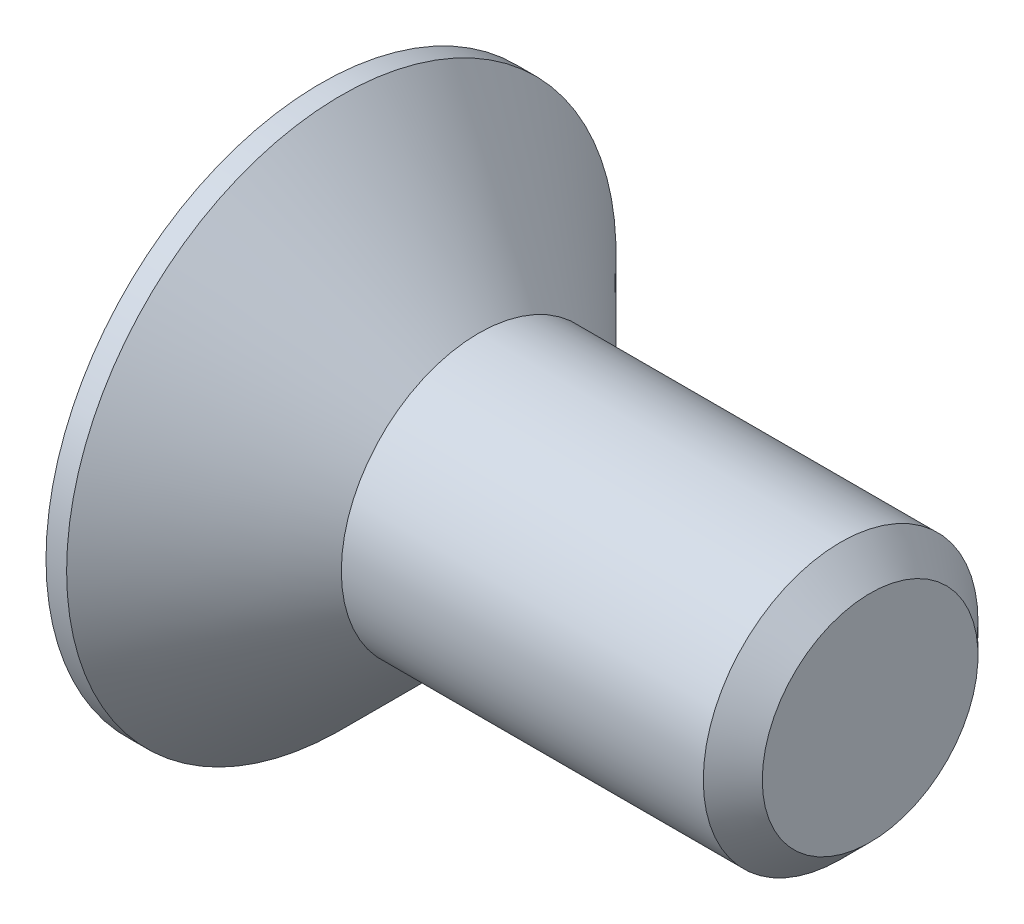
ISO-10303-21;
HEADER;
FILE_DESCRIPTION(('STEP AP214'),'2;1');
FILE_NAME('part.step','',(''),(''),'','','');
FILE_SCHEMA(('AUTOMOTIVE_DESIGN { 1 0 10303 214 1 1 1 1 }'));
ENDSEC;
DATA;
#1=APPLICATION_CONTEXT('core data for automotive mechanical design processes');
#2=APPLICATION_PROTOCOL_DEFINITION('international standard','automotive_design',2000,#1);
#3=PRODUCT_CONTEXT('',#1,'mechanical');
#4=PRODUCT('Part','Part','',(#3));
#5=PRODUCT_RELATED_PRODUCT_CATEGORY('part','',(#4));
#6=PRODUCT_DEFINITION_FORMATION('','',#4);
#7=PRODUCT_DEFINITION_CONTEXT('part definition',#1,'design');
#8=PRODUCT_DEFINITION('design','',#6,#7);
#9=PRODUCT_DEFINITION_SHAPE('','',#8);
#10=(LENGTH_UNIT() NAMED_UNIT(*) SI_UNIT(.MILLI.,.METRE.));
#11=(NAMED_UNIT(*) PLANE_ANGLE_UNIT() SI_UNIT($,.RADIAN.));
#12=(NAMED_UNIT(*) SI_UNIT($,.STERADIAN.) SOLID_ANGLE_UNIT());
#13=UNCERTAINTY_MEASURE_WITH_UNIT(LENGTH_MEASURE(1.E-05),#10,'distance_accuracy_value','');
#14=(GEOMETRIC_REPRESENTATION_CONTEXT(3) GLOBAL_UNCERTAINTY_ASSIGNED_CONTEXT((#13)) GLOBAL_UNIT_ASSIGNED_CONTEXT((#10,
#11,#12)) REPRESENTATION_CONTEXT('',''));
#15=CARTESIAN_POINT('',(0.,0.,0.));
#16=DIRECTION('',(0.,0.,1.));
#17=DIRECTION('',(1.,0.,0.));
#18=AXIS2_PLACEMENT_3D('',#15,#16,#17);
#19=CARTESIAN_POINT('',(0.,0.,0.));
#20=DIRECTION('',(1.,0.,0.));
#21=DIRECTION('',(0.,0.,-1.));
#22=AXIS2_PLACEMENT_3D('',#19,#20,#21);
#23=PLANE('',#22);
#24=DIRECTION('',(0.,-0.5,0.866025403784439));
#25=VECTOR('',#24,1.);
#26=CARTESIAN_POINT('',(0.,1.44337567297406,0.));
#27=LINE('',#26,#25);
#28=CARTESIAN_POINT('',(0.,1.44337567297406,0.));
#29=VERTEX_POINT('',#28);
#30=CARTESIAN_POINT('',(0.,0.721687836487032,1.25));
#31=VERTEX_POINT('',#30);
#32=EDGE_CURVE('E136',#29,#31,#27,.T.);
#33=ORIENTED_EDGE('',*,*,#32,.T.);
#34=DIRECTION('',(0.,-1.,0.));
#35=VECTOR('',#34,1.);
#36=CARTESIAN_POINT('',(0.,0.721687836487032,1.25));
#37=LINE('',#36,#35);
#38=CARTESIAN_POINT('',(0.,-0.721687836487032,1.25));
#39=VERTEX_POINT('',#38);
#40=EDGE_CURVE('E146',#31,#39,#37,.T.);
#41=ORIENTED_EDGE('',*,*,#40,.T.);
#42=DIRECTION('',(0.,-0.5,-0.866025403784439));
#43=VECTOR('',#42,1.);
#44=CARTESIAN_POINT('',(0.,-0.721687836487032,1.25));
#45=LINE('',#44,#43);
#46=CARTESIAN_POINT('',(0.,-1.44337567297406,0.));
#47=VERTEX_POINT('',#46);
#48=EDGE_CURVE('E152',#39,#47,#45,.T.);
#49=ORIENTED_EDGE('',*,*,#48,.T.);
#50=DIRECTION('',(0.,0.5,-0.866025403784439));
#51=VECTOR('',#50,1.);
#52=CARTESIAN_POINT('',(0.,-1.44337567297406,0.));
#53=LINE('',#52,#51);
#54=CARTESIAN_POINT('',(0.,-0.721687836487032,-1.25));
#55=VERTEX_POINT('',#54);
#56=EDGE_CURVE('E164',#47,#55,#53,.T.);
#57=ORIENTED_EDGE('',*,*,#56,.T.);
#58=DIRECTION('',(0.,1.,0.));
#59=VECTOR('',#58,1.);
#60=CARTESIAN_POINT('',(0.,-0.721687836487032,-1.25));
#61=LINE('',#60,#59);
#62=CARTESIAN_POINT('',(0.,0.721687836487032,-1.25));
#63=VERTEX_POINT('',#62);
#64=EDGE_CURVE('E167',#55,#63,#61,.T.);
#65=ORIENTED_EDGE('',*,*,#64,.T.);
#66=DIRECTION('',(0.,0.5,0.866025403784439));
#67=VECTOR('',#66,1.);
#68=CARTESIAN_POINT('',(0.,0.721687836487032,-1.25));
#69=LINE('',#68,#67);
#70=EDGE_CURVE('E157',#63,#29,#69,.T.);
#71=ORIENTED_EDGE('',*,*,#70,.T.);
#72=EDGE_LOOP('',(#33,#41,#49,#57,#65,#71));
#73=FACE_BOUND('',#72,.T.);
#74=CARTESIAN_POINT('',(0.,0.,0.));
#75=DIRECTION('',(-1.,0.,0.));
#76=DIRECTION('',(0.,0.,1.));
#77=AXIS2_PLACEMENT_3D('',#74,#75,#76);
#78=CIRCLE('',#77,4.);
#79=CARTESIAN_POINT('',(0.,0.,4.));
#80=VERTEX_POINT('',#79);
#81=EDGE_CURVE('E191',#80,#80,#78,.T.);
#82=ORIENTED_EDGE('',*,*,#81,.T.);
#83=EDGE_LOOP('',(#82));
#84=FACE_BOUND('',#83,.T.);
#85=ADVANCED_FACE('F39',(#73,#84),#23,.F.);
#86=CARTESIAN_POINT('',(2.3,0.,0.));
#87=DIRECTION('',(-1.,0.,0.));
#88=DIRECTION('',(0.,0.,1.));
#89=AXIS2_PLACEMENT_3D('',#86,#87,#88);
#90=CYLINDRICAL_SURFACE('',#89,4.);
#91=ORIENTED_EDGE('',*,*,#81,.F.);
#92=EDGE_LOOP('',(#91));
#93=FACE_BOUND('',#92,.T.);
#94=CARTESIAN_POINT('',(0.3,0.,0.));
#95=DIRECTION('',(-1.,0.,0.));
#96=DIRECTION('',(0.,0.,1.));
#97=AXIS2_PLACEMENT_3D('',#94,#95,#96);
#98=CIRCLE('',#97,4.);
#99=CARTESIAN_POINT('',(0.3,0.,4.));
#100=VERTEX_POINT('',#99);
#101=EDGE_CURVE('E188',#100,#100,#98,.T.);
#102=ORIENTED_EDGE('',*,*,#101,.T.);
#103=EDGE_LOOP('',(#102));
#104=FACE_BOUND('',#103,.T.);
#105=ADVANCED_FACE('F267',(#93,#104),#90,.T.);
#106=CARTESIAN_POINT('',(2.3,0.,0.));
#107=DIRECTION('',(-1.,0.,0.));
#108=DIRECTION('',(0.,0.,1.));
#109=AXIS2_PLACEMENT_3D('',#106,#107,#108);
#110=CONICAL_SURFACE('',#109,2.,0.785398163397448);
#111=ORIENTED_EDGE('',*,*,#101,.F.);
#112=EDGE_LOOP('',(#111));
#113=FACE_BOUND('',#112,.T.);
#114=CARTESIAN_POINT('',(2.3,0.,0.));
#115=DIRECTION('',(-1.,0.,0.));
#116=DIRECTION('',(0.,0.,1.));
#117=AXIS2_PLACEMENT_3D('',#114,#115,#116);
#118=CIRCLE('',#117,2.);
#119=CARTESIAN_POINT('',(2.3,0.,2.));
#120=VERTEX_POINT('',#119);
#121=EDGE_CURVE('E185',#120,#120,#118,.T.);
#122=ORIENTED_EDGE('',*,*,#121,.T.);
#123=EDGE_LOOP('',(#122));
#124=FACE_BOUND('',#123,.T.);
#125=ADVANCED_FACE('F271',(#113,#124),#110,.T.);
#126=CARTESIAN_POINT('',(8.,0.,0.));
#127=DIRECTION('',(-1.,0.,0.));
#128=DIRECTION('',(0.,0.,1.));
#129=AXIS2_PLACEMENT_3D('',#126,#127,#128);
#130=CYLINDRICAL_SURFACE('',#129,2.);
#131=ORIENTED_EDGE('',*,*,#121,.F.);
#132=EDGE_LOOP('',(#131));
#133=FACE_BOUND('',#132,.T.);
#134=CARTESIAN_POINT('',(7.5705,0.,0.));
#135=DIRECTION('',(-1.,0.,0.));
#136=DIRECTION('',(0.,0.,1.));
#137=AXIS2_PLACEMENT_3D('',#134,#135,#136);
#138=CIRCLE('',#137,2.);
#139=CARTESIAN_POINT('',(7.5705,0.,2.));
#140=VERTEX_POINT('',#139);
#141=EDGE_CURVE('E182',#140,#140,#138,.T.);
#142=ORIENTED_EDGE('',*,*,#141,.T.);
#143=EDGE_LOOP('',(#142));
#144=FACE_BOUND('',#143,.T.);
#145=ADVANCED_FACE('F276',(#133,#144),#130,.T.);
#146=CARTESIAN_POINT('',(8.,0.,0.));
#147=DIRECTION('',(-1.,0.,0.));
#148=DIRECTION('',(0.,0.,1.));
#149=AXIS2_PLACEMENT_3D('',#146,#147,#148);
#150=CONICAL_SURFACE('',#149,1.5705,0.785398163397448);
#151=ORIENTED_EDGE('',*,*,#141,.F.);
#152=EDGE_LOOP('',(#151));
#153=FACE_BOUND('',#152,.T.);
#154=CARTESIAN_POINT('',(8.,0.,0.));
#155=DIRECTION('',(-1.,0.,0.));
#156=DIRECTION('',(0.,0.,1.));
#157=AXIS2_PLACEMENT_3D('',#154,#155,#156);
#158=CIRCLE('',#157,1.5705);
#159=CARTESIAN_POINT('',(8.,0.,1.5705));
#160=VERTEX_POINT('',#159);
#161=EDGE_CURVE('E142',#160,#160,#158,.T.);
#162=ORIENTED_EDGE('',*,*,#161,.T.);
#163=EDGE_LOOP('',(#162));
#164=FACE_BOUND('',#163,.T.);
#165=ADVANCED_FACE('F284',(#153,#164),#150,.T.);
#166=CARTESIAN_POINT('',(8.,1.5705,0.));
#167=DIRECTION('',(-1.,0.,0.));
#168=DIRECTION('',(0.,0.,1.));
#169=AXIS2_PLACEMENT_3D('',#166,#167,#168);
#170=PLANE('',#169);
#171=ORIENTED_EDGE('',*,*,#161,.F.);
#172=EDGE_LOOP('',(#171));
#173=FACE_BOUND('',#172,.T.);
#174=ADVANCED_FACE('F264',(#173),#170,.F.);
#175=CARTESIAN_POINT('',(1.875,0.,0.));
#176=DIRECTION('',(1.,0.,0.));
#177=DIRECTION('',(0.,0.,-1.));
#178=AXIS2_PLACEMENT_3D('',#175,#176,#177);
#179=PLANE('',#178);
#180=DIRECTION('',(0.,0.5,0.866025403784439));
#181=VECTOR('',#180,1.);
#182=CARTESIAN_POINT('',(1.875,0.721687836487032,-1.25));
#183=LINE('',#182,#181);
#184=CARTESIAN_POINT('',(1.875,0.903122520066806,-0.935745909784649));
#185=VERTEX_POINT('',#184);
#186=CARTESIAN_POINT('',(1.875,1.26194098939429,-0.314254090215356));
#187=VERTEX_POINT('',#186);
#188=EDGE_CURVE('E160',#185,#187,#183,.T.);
#189=ORIENTED_EDGE('',*,*,#188,.F.);
#190=CARTESIAN_POINT('',(1.875,0.,0.));
#191=DIRECTION('',(1.,0.,0.));
#192=DIRECTION('',(0.,0.,-1.));
#193=AXIS2_PLACEMENT_3D('',#190,#191,#192);
#194=CIRCLE('',#193,1.30048094716167);
#195=EDGE_CURVE('E228',#185,#187,#194,.T.);
#196=ORIENTED_EDGE('',*,*,#195,.T.);
#197=EDGE_LOOP('',(#189,#196));
#198=FACE_BOUND('',#197,.T.);
#199=ADVANCED_FACE('F255',(#198),#179,.T.);
#200=DIRECTION('',(0.,-0.5,0.866025403784439));
#201=VECTOR('',#200,1.);
#202=CARTESIAN_POINT('',(1.875,1.44337567297406,0.));
#203=LINE('',#202,#201);
#204=CARTESIAN_POINT('',(1.875,1.26194098939429,0.314254090215357));
#205=VERTEX_POINT('',#204);
#206=CARTESIAN_POINT('',(1.875,0.903122520066806,0.935745909784649));
#207=VERTEX_POINT('',#206);
#208=EDGE_CURVE('E170',#205,#207,#203,.T.);
#209=ORIENTED_EDGE('',*,*,#208,.F.);
#210=EDGE_CURVE('E229',#205,#207,#194,.T.);
#211=ORIENTED_EDGE('',*,*,#210,.T.);
#212=EDGE_LOOP('',(#209,#211));
#213=FACE_BOUND('',#212,.T.);
#214=ADVANCED_FACE('F263',(#213),#179,.T.);
#215=DIRECTION('',(0.,-1.,0.));
#216=VECTOR('',#215,1.);
#217=CARTESIAN_POINT('',(1.875,0.721687836487032,1.25));
#218=LINE('',#217,#216);
#219=CARTESIAN_POINT('',(1.8750000000007,0.358818469327899,1.25));
#220=VERTEX_POINT('',#219);
#221=CARTESIAN_POINT('',(1.875,-0.358818469327484,1.25));
#222=VERTEX_POINT('',#221);
#223=EDGE_CURVE('E501',#220,#222,#218,.T.);
#224=ORIENTED_EDGE('',*,*,#223,.F.);
#225=EDGE_CURVE('E489',#220,#222,#194,.T.);
#226=ORIENTED_EDGE('',*,*,#225,.T.);
#227=EDGE_LOOP('',(#224,#226));
#228=FACE_BOUND('',#227,.T.);
#229=ADVANCED_FACE('F306',(#228),#179,.T.);
#230=DIRECTION('',(0.,-0.5,-0.866025403784439));
#231=VECTOR('',#230,1.);
#232=CARTESIAN_POINT('',(1.875,-0.721687836487032,1.25));
#233=LINE('',#232,#231);
#234=CARTESIAN_POINT('',(1.875,-0.903122520066806,0.935745909784649));
#235=VERTEX_POINT('',#234);
#236=CARTESIAN_POINT('',(1.875,-1.26194098939429,0.314254090215356));
#237=VERTEX_POINT('',#236);
#238=EDGE_CURVE('E503',#235,#237,#233,.T.);
#239=ORIENTED_EDGE('',*,*,#238,.F.);
#240=EDGE_CURVE('E51',#235,#237,#194,.T.);
#241=ORIENTED_EDGE('',*,*,#240,.T.);
#242=EDGE_LOOP('',(#239,#241));
#243=FACE_BOUND('',#242,.T.);
#244=ADVANCED_FACE('F259',(#243),#179,.T.);
#245=DIRECTION('',(0.,0.5,-0.866025403784439));
#246=VECTOR('',#245,1.);
#247=CARTESIAN_POINT('',(1.875,-1.44337567297406,0.));
#248=LINE('',#247,#246);
#249=CARTESIAN_POINT('',(1.875,-1.26194098939429,-0.314254090215351));
#250=VERTEX_POINT('',#249);
#251=CARTESIAN_POINT('',(1.875,-0.903122520066809,-0.935745909784643));
#252=VERTEX_POINT('',#251);
#253=EDGE_CURVE('E482',#250,#252,#248,.T.);
#254=ORIENTED_EDGE('',*,*,#253,.F.);
#255=EDGE_CURVE('E485',#250,#252,#194,.T.);
#256=ORIENTED_EDGE('',*,*,#255,.T.);
#257=EDGE_LOOP('',(#254,#256));
#258=FACE_BOUND('',#257,.T.);
#259=ADVANCED_FACE('F253',(#258),#179,.T.);
#260=DIRECTION('',(0.,1.,0.));
#261=VECTOR('',#260,1.);
#262=CARTESIAN_POINT('',(1.875,-0.721687836487032,-1.25));
#263=LINE('',#262,#261);
#264=CARTESIAN_POINT('',(1.875,-0.358818469327484,-1.25));
#265=VERTEX_POINT('',#264);
#266=CARTESIAN_POINT('',(1.8750000000007,0.358818469327899,-1.25));
#267=VERTEX_POINT('',#266);
#268=EDGE_CURVE('E507',#265,#267,#263,.T.);
#269=ORIENTED_EDGE('',*,*,#268,.F.);
#270=EDGE_CURVE('E240',#265,#267,#194,.T.);
#271=ORIENTED_EDGE('',*,*,#270,.T.);
#272=EDGE_LOOP('',(#269,#271));
#273=FACE_BOUND('',#272,.T.);
#274=ADVANCED_FACE('F249',(#273),#179,.T.);
#275=CARTESIAN_POINT('',(1.875,1.44337567297406,0.));
#276=DIRECTION('',(0.,-0.866025403784439,-0.5));
#277=DIRECTION('',(0.,0.5,-0.866025403784439));
#278=AXIS2_PLACEMENT_3D('',#275,#276,#277);
#279=PLANE('',#278);
#280=DIRECTION('',(-1.,0.,0.));
#281=VECTOR('',#280,1.);
#282=CARTESIAN_POINT('',(1.875,1.44337567297406,0.));
#283=LINE('',#282,#281);
#284=CARTESIAN_POINT('',(1.79249969158644,1.44337567297406,0.));
#285=VERTEX_POINT('',#284);
#286=EDGE_CURVE('E171',#285,#29,#283,.T.);
#287=ORIENTED_EDGE('',*,*,#286,.F.);
#288=CARTESIAN_POINT('',(1.79243301692041,1.4434911430279,-0.000199999999999952));
#289=CARTESIAN_POINT('',(1.8010785120796,1.42851898419889,0.0257325397908369));
#290=CARTESIAN_POINT('',(1.80935378878616,1.41349198472128,0.0517600663713691));
#291=CARTESIAN_POINT('',(1.82505715374292,1.3833432891464,0.103979138888988));
#292=CARTESIAN_POINT('',(1.83248604405018,1.36822169726946,0.130170504311167));
#293=CARTESIAN_POINT('',(1.84640781869943,1.3378679338415,0.182744764769327));
#294=CARTESIAN_POINT('',(1.85290056415285,1.32263574623363,0.209127687616574));
#295=CARTESIAN_POINT('',(1.86485321459689,1.29205554599242,0.262094148139977));
#296=CARTESIAN_POINT('',(1.87031212559843,1.27670743649689,0.288677853586364));
#297=CARTESIAN_POINT('',(1.8751999999999,1.26131221668114,0.315343156500947));
#298=B_SPLINE_CURVE_WITH_KNOTS('',3,(#288,#289,#290,#291,#292,#293,#294,#295,#296,#297),
.UNSPECIFIED.,.F.,.F.,(4,2,2,2,4),(0.,0.0935037058527126,0.186918055006586,0.28034624909424,
0.373863819495543),.UNSPECIFIED.);
#299=EDGE_CURVE('E201',#285,#205,#298,.T.);
#300=ORIENTED_EDGE('',*,*,#299,.T.);
#301=ORIENTED_EDGE('',*,*,#208,.T.);
#302=CARTESIAN_POINT('',(1.8751999999999,0.90375129277996,0.934656843499053));
#303=CARTESIAN_POINT('',(1.87031212559843,0.888356072964204,0.961322146413635));
#304=CARTESIAN_POINT('',(1.86485321459689,0.873007963468674,0.987905851860023));
#305=CARTESIAN_POINT('',(1.85290056415285,0.842427763227465,1.04087231238343));
#306=CARTESIAN_POINT('',(1.84640781869943,0.827195575619598,1.06725523523067));
#307=CARTESIAN_POINT('',(1.83248604405018,0.796841812191634,1.11982949568883));
#308=CARTESIAN_POINT('',(1.82505715374292,0.781720220314696,1.14602086111101));
#309=CARTESIAN_POINT('',(1.80935378878616,0.751571524739816,1.19823993362863));
#310=CARTESIAN_POINT('',(1.8010785120796,0.736544525262205,1.22426746020916));
#311=CARTESIAN_POINT('',(1.79243301692043,0.721572366433193,1.2502));
#312=B_SPLINE_CURVE_WITH_KNOTS('',3,(#302,#303,#304,#305,#306,#307,#308,#309,#310,#311),
.UNSPECIFIED.,.F.,.F.,(4,2,2,2,4),(0.,0.0935175704013025,0.186945764488957,0.280360113642829,
0.373863819495541),.UNSPECIFIED.);
#313=CARTESIAN_POINT('',(1.79249969158644,0.721687836487032,1.25));
#314=VERTEX_POINT('',#313);
#315=EDGE_CURVE('E139',#207,#314,#312,.T.);
#316=ORIENTED_EDGE('',*,*,#315,.T.);
#317=DIRECTION('',(-1.,0.,0.));
#318=VECTOR('',#317,1.);
#319=CARTESIAN_POINT('',(1.875,0.721687836487032,1.25));
#320=LINE('',#319,#318);
#321=EDGE_CURVE('E131',#314,#31,#320,.T.);
#322=ORIENTED_EDGE('',*,*,#321,.T.);
#323=ORIENTED_EDGE('',*,*,#32,.F.);
#324=EDGE_LOOP('',(#287,#300,#301,#316,#322,#323));
#325=FACE_BOUND('',#324,.T.);
#326=ADVANCED_FACE('F134',(#325),#279,.T.);
#327=CARTESIAN_POINT('',(1.875,0.721687836487032,1.25));
#328=DIRECTION('',(0.,0.,-1.));
#329=DIRECTION('',(-1.,0.,0.));
#330=AXIS2_PLACEMENT_3D('',#327,#328,#329);
#331=PLANE('',#330);
#332=ORIENTED_EDGE('',*,*,#321,.F.);
#333=CARTESIAN_POINT('',(1.28417160454505,-1.95899619723105,1.25));
#334=CARTESIAN_POINT('',(1.31082080764834,-1.90422867732636,1.25));
#335=CARTESIAN_POINT('',(1.33721971032247,-1.84933754146886,1.25));
#336=CARTESIAN_POINT('',(1.38937820563065,-1.73924257428,1.25));
#337=CARTESIAN_POINT('',(1.41513770141658,-1.68403869711572,1.25));
#338=CARTESIAN_POINT('',(1.46600394936254,-1.57297800745683,1.25));
#339=CARTESIAN_POINT('',(1.49110655690617,-1.51711928800002,1.25));
#340=CARTESIAN_POINT('',(1.54030640670235,-1.40496409577839,1.25));
#341=CARTESIAN_POINT('',(1.56440369509247,-1.34866764324363,1.25));
#342=CARTESIAN_POINT('',(1.63640450364759,-1.17519735580029,1.25));
#343=CARTESIAN_POINT('',(1.68227264826561,-1.05716481001892,1.25));
#344=CARTESIAN_POINT('',(1.76507296266875,-0.818126328640698,1.25));
#345=CARTESIAN_POINT('',(1.80202515890096,-0.697127742059264,1.25));
#346=CARTESIAN_POINT('',(1.84632290569901,-0.513281632345314,1.25));
#347=CARTESIAN_POINT('',(1.8592125506497,-0.45178785508143,1.25));
#348=CARTESIAN_POINT('',(1.88049133682255,-0.328012595649919,1.25));
#349=CARTESIAN_POINT('',(1.88888093373105,-0.265731193893167,1.25));
#350=CARTESIAN_POINT('',(1.90038440170809,-0.141513780121075,1.25));
#351=CARTESIAN_POINT('',(1.90356765570949,-0.0795843742400225,1.25));
#352=CARTESIAN_POINT('',(1.90457910563713,0.0443167000999126,1.25));
#353=CARTESIAN_POINT('',(1.90240725801724,0.106288368898369,1.25));
#354=CARTESIAN_POINT('',(1.89105356024658,0.253765316125754,1.25));
#355=CARTESIAN_POINT('',(1.87948224574393,0.33908808957503,1.25));
#356=CARTESIAN_POINT('',(1.8481613759434,0.508221287394186,1.25));
#357=CARTESIAN_POINT('',(1.82840410622843,0.592030207155334,1.25));
#358=CARTESIAN_POINT('',(1.78237952171875,0.759816088542928,1.25));
#359=CARTESIAN_POINT('',(1.75597622077063,0.843754714790782,1.25));
#360=CARTESIAN_POINT('',(1.69877986184022,1.01006736326784,1.25));
#361=CARTESIAN_POINT('',(1.66798789266194,1.09244176784445,1.25));
#362=CARTESIAN_POINT('',(1.59015697018098,1.28936285476343,1.25));
#363=CARTESIAN_POINT('',(1.54161828228179,1.40331051092491,1.25));
#364=CARTESIAN_POINT('',(1.44081301387604,1.6295559695525,1.25));
#365=CARTESIAN_POINT('',(1.38854529842094,1.74185325707111,1.25));
#366=CARTESIAN_POINT('',(1.28153291396248,1.96540816784222,1.25));
#367=CARTESIAN_POINT('',(1.22678556836345,2.07666450330311,1.25));
#368=CARTESIAN_POINT('',(1.1156530497119,2.29835695370855,1.25));
#369=CARTESIAN_POINT('',(1.05926781650605,2.40879303834093,1.25));
#370=CARTESIAN_POINT('',(0.950299829060462,2.61948953520597,1.25));
#371=CARTESIAN_POINT('',(0.897812857309427,2.71979961352431,1.25));
#372=CARTESIAN_POINT('',(0.79211944192572,2.92004452709963,1.25));
#373=CARTESIAN_POINT('',(0.738912969964078,3.01997934738244,1.25));
#374=CARTESIAN_POINT('',(0.632097619005767,3.21928827032499,1.25));
#375=CARTESIAN_POINT('',(0.578490202773841,3.31866315801399,1.25));
#376=CARTESIAN_POINT('',(0.470848412910779,3.51717384964029,1.25));
#377=CARTESIAN_POINT('',(0.416814064972364,3.61630966750316,1.25));
#378=CARTESIAN_POINT('',(0.362621047793214,3.71535803930486,1.25));
#379=B_SPLINE_CURVE_WITH_KNOTS('',3,(#333,#334,#335,#336,#337,#338,#339,#340,#341,#342,#343,
#344,#345,#346,#347,#348,#349,#350,#351,#352,#353,#354,#355,#356,#357,#358,#359,#360,#361,#362,
#363,#364,#365,#366,#367,#368,#369,#370,#371,#372,#373,#374,#375,#376,#377,#378),.UNSPECIFIED.,
.F.,.F.,(4,2,2,2,2,2,2,2,2,2,2,2,2,2,2,2,2,2,2,2,2,2,4),(0.,0.182722672003512,0.365472853368266,
0.549184000256598,0.732886706710678,1.11261434877003,1.49148096023727,1.6798372826596,
1.86817452803777,2.05398079603436,2.2397885749584,2.49756913437165,2.75559317988679,
3.01940038396607,3.28314225251485,3.65458812205852,4.02614752932834,4.39811804192806,
4.77010223289319,5.10973504955422,5.4493812777817,5.78811618557603,6.12683086128136),.UNSPECIFIED.);
#380=EDGE_CURVE('E484',#314,#220,#379,.F.);
#381=ORIENTED_EDGE('',*,*,#380,.T.);
#382=ORIENTED_EDGE('',*,*,#223,.T.);
#383=CARTESIAN_POINT('',(1.7924996915865,-0.721687836487119,1.25));
#384=VERTEX_POINT('',#383);
#385=EDGE_CURVE('E486',#222,#384,#379,.F.);
#386=ORIENTED_EDGE('',*,*,#385,.T.);
#387=DIRECTION('',(-1.,0.,0.));
#388=VECTOR('',#387,1.);
#389=CARTESIAN_POINT('',(1.875,-0.721687836487032,1.25));
#390=LINE('',#389,#388);
#391=EDGE_CURVE('E143',#384,#39,#390,.T.);
#392=ORIENTED_EDGE('',*,*,#391,.T.);
#393=ORIENTED_EDGE('',*,*,#40,.F.);
#394=EDGE_LOOP('',(#332,#381,#382,#386,#392,#393));
#395=FACE_BOUND('',#394,.T.);
#396=ADVANCED_FACE('F147',(#395),#331,.T.);
#397=CARTESIAN_POINT('',(1.875,-0.721687836487032,1.25));
#398=DIRECTION('',(0.,0.866025403784439,-0.5));
#399=DIRECTION('',(0.,0.5,0.866025403784439));
#400=AXIS2_PLACEMENT_3D('',#397,#398,#399);
#401=PLANE('',#400);
#402=ORIENTED_EDGE('',*,*,#391,.F.);
#403=CARTESIAN_POINT('',(1.79243301692041,-0.721572366433194,1.2502));
#404=CARTESIAN_POINT('',(1.8010785120796,-0.736544525262205,1.22426746020916));
#405=CARTESIAN_POINT('',(1.80935378878616,-0.751571524739815,1.19823993362863));
#406=CARTESIAN_POINT('',(1.82505715374292,-0.781720220314695,1.14602086111101));
#407=CARTESIAN_POINT('',(1.83248604405018,-0.796841812191634,1.11982949568883));
#408=CARTESIAN_POINT('',(1.84640781869943,-0.827195575619598,1.06725523523067));
#409=CARTESIAN_POINT('',(1.85290056415285,-0.842427763227465,1.04087231238343));
#410=CARTESIAN_POINT('',(1.86485321459689,-0.873007963468673,0.987905851860023));
#411=CARTESIAN_POINT('',(1.87031212559843,-0.888356072964203,0.961322146413636));
#412=CARTESIAN_POINT('',(1.8751999999999,-0.90375129277996,0.934656843499053));
#413=B_SPLINE_CURVE_WITH_KNOTS('',3,(#403,#404,#405,#406,#407,#408,#409,#410,#411,#412),
.UNSPECIFIED.,.F.,.F.,(4,2,2,2,4),(0.,0.0935037058527127,0.186918055006586,0.28034624909424,
0.373863819495543),.UNSPECIFIED.);
#414=EDGE_CURVE('E11',#384,#235,#413,.T.);
#415=ORIENTED_EDGE('',*,*,#414,.T.);
#416=ORIENTED_EDGE('',*,*,#238,.T.);
#417=CARTESIAN_POINT('',(1.8751999999999,-1.26131221668114,0.315343156500947));
#418=CARTESIAN_POINT('',(1.87031212559843,-1.27670743649689,0.288677853586365));
#419=CARTESIAN_POINT('',(1.86485321459689,-1.29205554599242,0.262094148139977));
#420=CARTESIAN_POINT('',(1.85290056415285,-1.32263574623363,0.209127687616574));
#421=CARTESIAN_POINT('',(1.84640781869943,-1.3378679338415,0.182744764769327));
#422=CARTESIAN_POINT('',(1.83248604405018,-1.36822169726946,0.130170504311167));
#423=CARTESIAN_POINT('',(1.82505715374292,-1.3833432891464,0.103979138888989));
#424=CARTESIAN_POINT('',(1.80935378878616,-1.41349198472128,0.0517600663713698));
#425=CARTESIAN_POINT('',(1.8010785120796,-1.42851898419889,0.0257325397908369));
#426=CARTESIAN_POINT('',(1.79243301692043,-1.4434911430279,-0.000200000000002226));
#427=B_SPLINE_CURVE_WITH_KNOTS('',3,(#417,#418,#419,#420,#421,#422,#423,#424,#425,#426),
.UNSPECIFIED.,.F.,.F.,(4,2,2,2,4),(0.,0.0935175704013027,0.186945764488957,0.280360113642829,
0.373863819495541),.UNSPECIFIED.);
#428=CARTESIAN_POINT('',(1.79249969158644,-1.44337567297406,0.));
#429=VERTEX_POINT('',#428);
#430=EDGE_CURVE('E494',#237,#429,#427,.T.);
#431=ORIENTED_EDGE('',*,*,#430,.T.);
#432=DIRECTION('',(-1.,0.,0.));
#433=VECTOR('',#432,1.);
#434=CARTESIAN_POINT('',(1.875,-1.44337567297406,0.));
#435=LINE('',#434,#433);
#436=EDGE_CURVE('E177',#429,#47,#435,.T.);
#437=ORIENTED_EDGE('',*,*,#436,.T.);
#438=ORIENTED_EDGE('',*,*,#48,.F.);
#439=EDGE_LOOP('',(#402,#415,#416,#431,#437,#438));
#440=FACE_BOUND('',#439,.T.);
#441=ADVANCED_FACE('F342',(#440),#401,.T.);
#442=CARTESIAN_POINT('',(1.875,-1.44337567297406,0.));
#443=DIRECTION('',(0.,0.866025403784439,0.5));
#444=DIRECTION('',(0.,-0.5,0.866025403784439));
#445=AXIS2_PLACEMENT_3D('',#442,#443,#444);
#446=PLANE('',#445);
#447=ORIENTED_EDGE('',*,*,#436,.F.);
#448=CARTESIAN_POINT('',(1.79243301692041,-1.4434911430279,0.000199999999999952));
#449=CARTESIAN_POINT('',(1.80107851207961,-1.42851898419887,-0.0257325397908807));
#450=CARTESIAN_POINT('',(1.80935378878619,-1.41349198472123,-0.051760066371457));
#451=CARTESIAN_POINT('',(1.82505715374297,-1.3833432891463,-0.103979138889165));
#452=CARTESIAN_POINT('',(1.83248604405025,-1.36822169726934,-0.130170504311388));
#453=CARTESIAN_POINT('',(1.84640781869951,-1.33786793384132,-0.182744764769638));
#454=CARTESIAN_POINT('',(1.85290056415294,-1.32263574623343,-0.20912768761693));
#455=CARTESIAN_POINT('',(1.86485321459698,-1.29205554599216,-0.262094148140424));
#456=CARTESIAN_POINT('',(1.87031212559853,-1.27670743649661,-0.288677853586858));
#457=CARTESIAN_POINT('',(1.8752,-1.26131221668082,-0.315343156501487));
#458=B_SPLINE_CURVE_WITH_KNOTS('',3,(#448,#449,#450,#451,#452,#453,#454,#455,#456,#457),
.UNSPECIFIED.,.F.,.F.,(4,2,2,2,4),(0.,0.0935037058528704,0.186918055006901,0.280346249094713,
0.373863819496174),.UNSPECIFIED.);
#459=EDGE_CURVE('E491',#429,#250,#458,.T.);
#460=ORIENTED_EDGE('',*,*,#459,.T.);
#461=ORIENTED_EDGE('',*,*,#253,.T.);
#462=CARTESIAN_POINT('',(1.8752,-0.903751292780272,-0.934656843498513));
#463=CARTESIAN_POINT('',(1.87031212559853,-0.888356072964488,-0.961322146413141));
#464=CARTESIAN_POINT('',(1.86485321459698,-0.873007963468932,-0.987905851859575));
#465=CARTESIAN_POINT('',(1.85290056415294,-0.842427763227671,-1.04087231238307));
#466=CARTESIAN_POINT('',(1.84640781869951,-0.827195575619778,-1.06725523523036));
#467=CARTESIAN_POINT('',(1.83248604405025,-0.796841812191762,-1.11982949568861));
#468=CARTESIAN_POINT('',(1.82505715374297,-0.781720220314798,-1.14602086111083));
#469=CARTESIAN_POINT('',(1.80935378878619,-0.751571524739866,-1.19823993362854));
#470=CARTESIAN_POINT('',(1.80107851207962,-0.73654452526223,-1.22426746020912));
#471=CARTESIAN_POINT('',(1.79243301692043,-0.721572366433193,-1.2502));
#472=B_SPLINE_CURVE_WITH_KNOTS('',3,(#462,#463,#464,#465,#466,#467,#468,#469,#470,#471),
.UNSPECIFIED.,.F.,.F.,(4,2,2,2,4),(0.,0.0935175704014609,0.186945764489272,0.280360113643302,
0.373863819496173),.UNSPECIFIED.);
#473=CARTESIAN_POINT('',(1.7924996915865,-0.721687836487119,-1.25));
#474=VERTEX_POINT('',#473);
#475=EDGE_CURVE('E241',#252,#474,#472,.T.);
#476=ORIENTED_EDGE('',*,*,#475,.T.);
#477=DIRECTION('',(-1.,0.,0.));
#478=VECTOR('',#477,1.);
#479=CARTESIAN_POINT('',(1.875,-0.721687836487032,-1.25));
#480=LINE('',#479,#478);
#481=EDGE_CURVE('E175',#474,#55,#480,.T.);
#482=ORIENTED_EDGE('',*,*,#481,.T.);
#483=ORIENTED_EDGE('',*,*,#56,.F.);
#484=EDGE_LOOP('',(#447,#460,#461,#476,#482,#483));
#485=FACE_BOUND('',#484,.T.);
#486=ADVANCED_FACE('F379',(#485),#446,.T.);
#487=CARTESIAN_POINT('',(1.875,-0.721687836487032,-1.25));
#488=DIRECTION('',(0.,0.,1.));
#489=DIRECTION('',(1.,0.,0.));
#490=AXIS2_PLACEMENT_3D('',#487,#488,#489);
#491=PLANE('',#490);
#492=ORIENTED_EDGE('',*,*,#481,.F.);
#493=CARTESIAN_POINT('',(1.28417160454505,-1.95899619723105,-1.25));
#494=CARTESIAN_POINT('',(1.31082080764834,-1.90422867732636,-1.25));
#495=CARTESIAN_POINT('',(1.33721971032247,-1.84933754146886,-1.25));
#496=CARTESIAN_POINT('',(1.38937820563065,-1.73924257428,-1.25));
#497=CARTESIAN_POINT('',(1.41513770141658,-1.68403869711572,-1.25));
#498=CARTESIAN_POINT('',(1.46600394936254,-1.57297800745683,-1.25));
#499=CARTESIAN_POINT('',(1.49110655690617,-1.51711928800002,-1.25));
#500=CARTESIAN_POINT('',(1.54030640670235,-1.40496409577839,-1.25));
#501=CARTESIAN_POINT('',(1.56440369509247,-1.34866764324363,-1.25));
#502=CARTESIAN_POINT('',(1.63640450364759,-1.17519735580029,-1.25));
#503=CARTESIAN_POINT('',(1.68227264826561,-1.05716481001892,-1.25));
#504=CARTESIAN_POINT('',(1.76507296266875,-0.818126328640698,-1.25));
#505=CARTESIAN_POINT('',(1.80202515890096,-0.697127742059264,-1.25));
#506=CARTESIAN_POINT('',(1.84632290569901,-0.513281632345314,-1.25));
#507=CARTESIAN_POINT('',(1.8592125506497,-0.45178785508143,-1.25));
#508=CARTESIAN_POINT('',(1.88049133682255,-0.328012595649919,-1.25));
#509=CARTESIAN_POINT('',(1.88888093373105,-0.265731193893167,-1.25));
#510=CARTESIAN_POINT('',(1.90038440170809,-0.141513780121075,-1.25));
#511=CARTESIAN_POINT('',(1.90356765570949,-0.0795843742400225,-1.25));
#512=CARTESIAN_POINT('',(1.90457910563713,0.0443167000999126,-1.25));
#513=CARTESIAN_POINT('',(1.90240725801724,0.106288368898369,-1.25));
#514=CARTESIAN_POINT('',(1.89105356024658,0.253765316125754,-1.25));
#515=CARTESIAN_POINT('',(1.87948224574393,0.33908808957503,-1.25));
#516=CARTESIAN_POINT('',(1.8481613759434,0.508221287394186,-1.25));
#517=CARTESIAN_POINT('',(1.82840410622843,0.592030207155334,-1.25));
#518=CARTESIAN_POINT('',(1.78237952171875,0.759816088542928,-1.25));
#519=CARTESIAN_POINT('',(1.75597622077063,0.843754714790782,-1.25));
#520=CARTESIAN_POINT('',(1.69877986184022,1.01006736326784,-1.25));
#521=CARTESIAN_POINT('',(1.66798789266194,1.09244176784445,-1.25));
#522=CARTESIAN_POINT('',(1.59015697018098,1.28936285476343,-1.25));
#523=CARTESIAN_POINT('',(1.54161828228179,1.40331051092491,-1.25));
#524=CARTESIAN_POINT('',(1.44081301387604,1.6295559695525,-1.25));
#525=CARTESIAN_POINT('',(1.38854529842094,1.74185325707111,-1.25));
#526=CARTESIAN_POINT('',(1.28153291396248,1.96540816784222,-1.25));
#527=CARTESIAN_POINT('',(1.22678556836345,2.07666450330311,-1.25));
#528=CARTESIAN_POINT('',(1.1156530497119,2.29835695370855,-1.25));
#529=CARTESIAN_POINT('',(1.05926781650605,2.40879303834093,-1.25));
#530=CARTESIAN_POINT('',(0.950299829060462,2.61948953520597,-1.25));
#531=CARTESIAN_POINT('',(0.897812857309427,2.71979961352431,-1.25));
#532=CARTESIAN_POINT('',(0.79211944192572,2.92004452709963,-1.25));
#533=CARTESIAN_POINT('',(0.738912969964078,3.01997934738244,-1.25));
#534=CARTESIAN_POINT('',(0.632097619005767,3.21928827032499,-1.25));
#535=CARTESIAN_POINT('',(0.578490202773841,3.31866315801399,-1.25));
#536=CARTESIAN_POINT('',(0.470848412910779,3.51717384964029,-1.25));
#537=CARTESIAN_POINT('',(0.416814064972364,3.61630966750316,-1.25));
#538=CARTESIAN_POINT('',(0.362621047793214,3.71535803930486,-1.25));
#539=B_SPLINE_CURVE_WITH_KNOTS('',3,(#493,#494,#495,#496,#497,#498,#499,#500,#501,#502,#503,
#504,#505,#506,#507,#508,#509,#510,#511,#512,#513,#514,#515,#516,#517,#518,#519,#520,#521,#522,
#523,#524,#525,#526,#527,#528,#529,#530,#531,#532,#533,#534,#535,#536,#537,#538),.UNSPECIFIED.,
.F.,.F.,(4,2,2,2,2,2,2,2,2,2,2,2,2,2,2,2,2,2,2,2,2,2,4),(0.,0.182722672003512,0.365472853368266,
0.549184000256598,0.732886706710678,1.11261434877003,1.49148096023727,1.6798372826596,
1.86817452803777,2.05398079603436,2.2397885749584,2.49756913437165,2.75559317988679,
3.01940038396607,3.28314225251485,3.65458812205852,4.02614752932834,4.39811804192806,
4.77010223289319,5.10973504955422,5.4493812777817,5.78811618557603,6.12683086128136),.UNSPECIFIED.);
#540=EDGE_CURVE('E235',#474,#265,#539,.T.);
#541=ORIENTED_EDGE('',*,*,#540,.T.);
#542=ORIENTED_EDGE('',*,*,#268,.T.);
#543=CARTESIAN_POINT('',(1.79249969158644,0.721687836487032,-1.25));
#544=VERTEX_POINT('',#543);
#545=EDGE_CURVE('E227',#267,#544,#539,.T.);
#546=ORIENTED_EDGE('',*,*,#545,.T.);
#547=DIRECTION('',(-1.,0.,0.));
#548=VECTOR('',#547,1.);
#549=CARTESIAN_POINT('',(1.875,0.721687836487032,-1.25));
#550=LINE('',#549,#548);
#551=EDGE_CURVE('E173',#544,#63,#550,.T.);
#552=ORIENTED_EDGE('',*,*,#551,.T.);
#553=ORIENTED_EDGE('',*,*,#64,.F.);
#554=EDGE_LOOP('',(#492,#541,#542,#546,#552,#553));
#555=FACE_BOUND('',#554,.T.);
#556=ADVANCED_FACE('F215',(#555),#491,.T.);
#557=CARTESIAN_POINT('',(1.875,0.721687836487032,-1.25));
#558=DIRECTION('',(0.,-0.866025403784439,0.5));
#559=DIRECTION('',(0.,-0.5,-0.866025403784439));
#560=AXIS2_PLACEMENT_3D('',#557,#558,#559);
#561=PLANE('',#560);
#562=ORIENTED_EDGE('',*,*,#551,.F.);
#563=CARTESIAN_POINT('',(1.79243301692041,0.721572366433194,-1.2502));
#564=CARTESIAN_POINT('',(1.80107851207961,0.73654452526223,-1.22426746020912));
#565=CARTESIAN_POINT('',(1.80935378878619,0.751571524739866,-1.19823993362854));
#566=CARTESIAN_POINT('',(1.82505715374297,0.781720220314797,-1.14602086111084));
#567=CARTESIAN_POINT('',(1.83248604405025,0.796841812191762,-1.11982949568861));
#568=CARTESIAN_POINT('',(1.84640781869951,0.827195575619778,-1.06725523523036));
#569=CARTESIAN_POINT('',(1.85290056415294,0.842427763227671,-1.04087231238307));
#570=CARTESIAN_POINT('',(1.86485321459698,0.873007963468932,-0.987905851859576));
#571=CARTESIAN_POINT('',(1.87031212559853,0.888356072964488,-0.961322146413142));
#572=CARTESIAN_POINT('',(1.8752,0.903751292780272,-0.934656843498513));
#573=B_SPLINE_CURVE_WITH_KNOTS('',3,(#563,#564,#565,#566,#567,#568,#569,#570,#571,#572),
.UNSPECIFIED.,.F.,.F.,(4,2,2,2,4),(0.,0.0935037058528705,0.186918055006901,0.280346249094713,
0.373863819496174),.UNSPECIFIED.);
#574=EDGE_CURVE('E221',#544,#185,#573,.T.);
#575=ORIENTED_EDGE('',*,*,#574,.T.);
#576=ORIENTED_EDGE('',*,*,#188,.T.);
#577=CARTESIAN_POINT('',(1.8752,1.26131221668082,-0.315343156501486));
#578=CARTESIAN_POINT('',(1.87031212559853,1.27670743649661,-0.288677853586858));
#579=CARTESIAN_POINT('',(1.86485321459698,1.29205554599216,-0.262094148140424));
#580=CARTESIAN_POINT('',(1.85290056415294,1.32263574623343,-0.20912768761693));
#581=CARTESIAN_POINT('',(1.84640781869951,1.33786793384132,-0.182744764769638));
#582=CARTESIAN_POINT('',(1.83248604405025,1.36822169726933,-0.130170504311388));
#583=CARTESIAN_POINT('',(1.82505715374297,1.3833432891463,-0.103979138889166));
#584=CARTESIAN_POINT('',(1.80935378878619,1.41349198472123,-0.0517600663714576));
#585=CARTESIAN_POINT('',(1.80107851207962,1.42851898419887,-0.0257325397908806));
#586=CARTESIAN_POINT('',(1.79243301692043,1.4434911430279,0.00020000000000215));
#587=B_SPLINE_CURVE_WITH_KNOTS('',3,(#577,#578,#579,#580,#581,#582,#583,#584,#585,#586),
.UNSPECIFIED.,.F.,.F.,(4,2,2,2,4),(0.,0.0935175704014609,0.186945764489272,0.280360113643302,
0.373863819496172),.UNSPECIFIED.);
#588=EDGE_CURVE('E194',#187,#285,#587,.T.);
#589=ORIENTED_EDGE('',*,*,#588,.T.);
#590=ORIENTED_EDGE('',*,*,#286,.T.);
#591=ORIENTED_EDGE('',*,*,#70,.F.);
#592=EDGE_LOOP('',(#562,#575,#576,#589,#590,#591));
#593=FACE_BOUND('',#592,.T.);
#594=ADVANCED_FACE('F211',(#593),#561,.T.);
#595=CARTESIAN_POINT('',(2.62583302491977,0.,0.));
#596=DIRECTION('',(-1.,0.,0.));
#597=DIRECTION('',(0.,0.,1.));
#598=AXIS2_PLACEMENT_3D('',#595,#596,#597);
#599=CONICAL_SURFACE('',#598,0.,1.0471975511966);
#600=ORIENTED_EDGE('',*,*,#414,.F.);
#601=ORIENTED_EDGE('',*,*,#385,.F.);
#602=ORIENTED_EDGE('',*,*,#225,.F.);
#603=ORIENTED_EDGE('',*,*,#380,.F.);
#604=ORIENTED_EDGE('',*,*,#315,.F.);
#605=ORIENTED_EDGE('',*,*,#210,.F.);
#606=ORIENTED_EDGE('',*,*,#299,.F.);
#607=ORIENTED_EDGE('',*,*,#588,.F.);
#608=ORIENTED_EDGE('',*,*,#195,.F.);
#609=ORIENTED_EDGE('',*,*,#574,.F.);
#610=ORIENTED_EDGE('',*,*,#545,.F.);
#611=ORIENTED_EDGE('',*,*,#270,.F.);
#612=ORIENTED_EDGE('',*,*,#540,.F.);
#613=ORIENTED_EDGE('',*,*,#475,.F.);
#614=ORIENTED_EDGE('',*,*,#255,.F.);
#615=ORIENTED_EDGE('',*,*,#459,.F.);
#616=ORIENTED_EDGE('',*,*,#430,.F.);
#617=ORIENTED_EDGE('',*,*,#240,.F.);
#618=EDGE_LOOP('',(#600,#601,#602,#603,#604,#605,#606,#607,#608,#609,#610,#611,#612,#613,#614,
#615,#616,#617));
#619=FACE_BOUND('',#618,.T.);
#620=CARTESIAN_POINT('',(2.62583302491977,0.,0.));
#621=VERTEX_POINT('',#620);
#622=VERTEX_LOOP('',#621);
#623=FACE_BOUND('',#622,.T.);
#624=ADVANCED_FACE('F207',(#619,#623),#599,.F.);
#625=CLOSED_SHELL('',(#85,#105,#125,#145,#165,#174,#199,#214,#229,#244,#259,#274,#326,#396,#441,
#486,#556,#594,#624));
#626=MANIFOLD_SOLID_BREP('B2',#625);
#627=ADVANCED_BREP_SHAPE_REPRESENTATION('',(#18,#626),#14);
#628=SHAPE_DEFINITION_REPRESENTATION(#9,#627);
ENDSEC;
END-ISO-10303-21;
